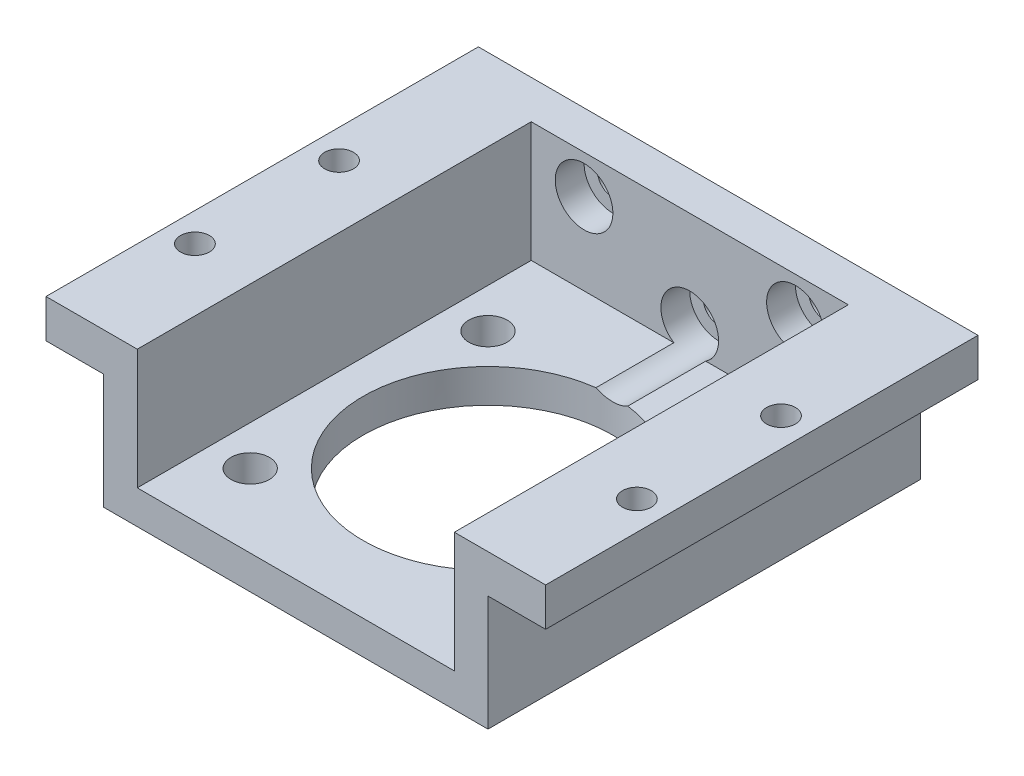
ISO-10303-21;
HEADER;
FILE_DESCRIPTION(('STEP AP214'),'2;1');
FILE_NAME('part.step','',(''),(''),'','','');
FILE_SCHEMA(('AUTOMOTIVE_DESIGN { 1 0 10303 214 1 1 1 1 }'));
ENDSEC;
DATA;
#1=APPLICATION_CONTEXT('core data for automotive mechanical design processes');
#2=APPLICATION_PROTOCOL_DEFINITION('international standard','automotive_design',2000,#1);
#3=PRODUCT_CONTEXT('',#1,'mechanical');
#4=PRODUCT('Part','Part','',(#3));
#5=PRODUCT_RELATED_PRODUCT_CATEGORY('part','',(#4));
#6=PRODUCT_DEFINITION_FORMATION('','',#4);
#7=PRODUCT_DEFINITION_CONTEXT('part definition',#1,'design');
#8=PRODUCT_DEFINITION('design','',#6,#7);
#9=PRODUCT_DEFINITION_SHAPE('','',#8);
#10=(LENGTH_UNIT() NAMED_UNIT(*) SI_UNIT(.MILLI.,.METRE.));
#11=(NAMED_UNIT(*) PLANE_ANGLE_UNIT() SI_UNIT($,.RADIAN.));
#12=(NAMED_UNIT(*) SI_UNIT($,.STERADIAN.) SOLID_ANGLE_UNIT());
#13=UNCERTAINTY_MEASURE_WITH_UNIT(LENGTH_MEASURE(1.E-05),#10,'distance_accuracy_value','');
#14=(GEOMETRIC_REPRESENTATION_CONTEXT(3) GLOBAL_UNCERTAINTY_ASSIGNED_CONTEXT((#13)) GLOBAL_UNIT_ASSIGNED_CONTEXT((#10,
#11,#12)) REPRESENTATION_CONTEXT('',''));
#15=CARTESIAN_POINT('',(0.,0.,0.));
#16=DIRECTION('',(0.,0.,1.));
#17=DIRECTION('',(1.,0.,0.));
#18=AXIS2_PLACEMENT_3D('',#15,#16,#17);
#19=CARTESIAN_POINT('',(0.,14.8987856394065,0.));
#20=DIRECTION('',(0.,1.,0.));
#21=DIRECTION('',(0.,0.,1.));
#22=AXIS2_PLACEMENT_3D('',#19,#20,#21);
#23=PLANE('',#22);
#24=CARTESIAN_POINT('',(12.3743686707646,14.8987856394065,32.3743686707646));
#25=DIRECTION('',(0.,1.,0.));
#26=DIRECTION('',(0.,0.,1.));
#27=AXIS2_PLACEMENT_3D('',#24,#25,#26);
#28=CIRCLE('',#27,2.);
#29=CARTESIAN_POINT('',(12.3743686707646,14.8987856394065,34.3743686707646));
#30=VERTEX_POINT('',#29);
#31=EDGE_CURVE('E233',#30,#30,#28,.F.);
#32=ORIENTED_EDGE('',*,*,#31,.T.);
#33=EDGE_LOOP('',(#32));
#34=FACE_BOUND('',#33,.T.);
#35=CARTESIAN_POINT('',(-12.3743686707646,14.8987856394065,7.62563132923544));
#36=DIRECTION('',(0.,1.,0.));
#37=DIRECTION('',(0.,0.,1.));
#38=AXIS2_PLACEMENT_3D('',#35,#36,#37);
#39=CIRCLE('',#38,2.);
#40=CARTESIAN_POINT('',(-12.3743686707646,14.8987856394065,9.62563132923544));
#41=VERTEX_POINT('',#40);
#42=EDGE_CURVE('E227',#41,#41,#39,.F.);
#43=ORIENTED_EDGE('',*,*,#42,.T.);
#44=EDGE_LOOP('',(#43));
#45=FACE_BOUND('',#44,.T.);
#46=CARTESIAN_POINT('',(-12.3743686707644,14.8987856394065,32.3743686707647));
#47=DIRECTION('',(0.,1.,0.));
#48=DIRECTION('',(0.,0.,1.));
#49=AXIS2_PLACEMENT_3D('',#46,#47,#48);
#50=CIRCLE('',#49,2.);
#51=CARTESIAN_POINT('',(-12.3743686707644,14.8987856394065,34.3743686707647));
#52=VERTEX_POINT('',#51);
#53=EDGE_CURVE('E226',#52,#52,#50,.F.);
#54=ORIENTED_EDGE('',*,*,#53,.T.);
#55=EDGE_LOOP('',(#54));
#56=FACE_BOUND('',#55,.T.);
#57=CARTESIAN_POINT('',(12.3743686707645,14.8987856394065,7.62563132923535));
#58=DIRECTION('',(0.,1.,0.));
#59=DIRECTION('',(0.,0.,1.));
#60=AXIS2_PLACEMENT_3D('',#57,#58,#59);
#61=CIRCLE('',#60,2.);
#62=CARTESIAN_POINT('',(12.3743686707645,14.8987856394065,9.62563132923535));
#63=VERTEX_POINT('',#62);
#64=EDGE_CURVE('E230',#63,#63,#61,.F.);
#65=ORIENTED_EDGE('',*,*,#64,.T.);
#66=EDGE_LOOP('',(#65));
#67=FACE_BOUND('',#66,.T.);
#68=DIRECTION('',(1.,0.,0.));
#69=VECTOR('',#68,1.);
#70=CARTESIAN_POINT('',(-16.5,14.8987856394065,-1.));
#71=LINE('',#70,#69);
#72=CARTESIAN_POINT('',(1.65831239517132,14.8987856394065,-1.));
#73=VERTEX_POINT('',#72);
#74=CARTESIAN_POINT('',(16.5,14.8987856394065,-1.));
#75=VERTEX_POINT('',#74);
#76=EDGE_CURVE('E164',#73,#75,#71,.T.);
#77=ORIENTED_EDGE('',*,*,#76,.F.);
#78=DIRECTION('',(0.,0.,-1.));
#79=VECTOR('',#78,1.);
#80=CARTESIAN_POINT('',(1.65831239517132,14.8987856394065,13.));
#81=LINE('',#80,#79);
#82=CARTESIAN_POINT('',(1.65831239517132,14.8987856394065,7.10620304177155));
#83=VERTEX_POINT('',#82);
#84=EDGE_CURVE('E151',#73,#83,#81,.F.);
#85=ORIENTED_EDGE('',*,*,#84,.T.);
#86=CARTESIAN_POINT('',(0.,14.8987856394065,20.));
#87=DIRECTION('',(0.,1.,0.));
#88=DIRECTION('',(0.,0.,1.));
#89=AXIS2_PLACEMENT_3D('',#86,#87,#88);
#90=CIRCLE('',#89,13.);
#91=CARTESIAN_POINT('',(-1.65831239517136,14.8987856394065,7.10620304177156));
#92=VERTEX_POINT('',#91);
#93=EDGE_CURVE('E148',#83,#92,#90,.F.);
#94=ORIENTED_EDGE('',*,*,#93,.T.);
#95=DIRECTION('',(0.,0.,-1.));
#96=VECTOR('',#95,1.);
#97=CARTESIAN_POINT('',(-1.65831239517136,14.8987856394065,13.));
#98=LINE('',#97,#96);
#99=CARTESIAN_POINT('',(-1.65831239517136,14.8987856394065,-1.));
#100=VERTEX_POINT('',#99);
#101=EDGE_CURVE('E141',#92,#100,#98,.T.);
#102=ORIENTED_EDGE('',*,*,#101,.T.);
#103=CARTESIAN_POINT('',(-16.5,14.8987856394065,-1.));
#104=VERTEX_POINT('',#103);
#105=EDGE_CURVE('E145',#104,#100,#71,.T.);
#106=ORIENTED_EDGE('',*,*,#105,.F.);
#107=DIRECTION('',(0.,0.,1.));
#108=VECTOR('',#107,1.);
#109=CARTESIAN_POINT('',(-16.5,14.8987856394065,0.));
#110=LINE('',#109,#108);
#111=CARTESIAN_POINT('',(-16.5,14.8987856394065,40.));
#112=VERTEX_POINT('',#111);
#113=EDGE_CURVE('E221',#104,#112,#110,.T.);
#114=ORIENTED_EDGE('',*,*,#113,.T.);
#115=DIRECTION('',(1.,0.,0.));
#116=VECTOR('',#115,1.);
#117=CARTESIAN_POINT('',(-16.5,14.8987856394065,40.));
#118=LINE('',#117,#116);
#119=CARTESIAN_POINT('',(16.5,14.8987856394065,40.));
#120=VERTEX_POINT('',#119);
#121=EDGE_CURVE('E223',#112,#120,#118,.T.);
#122=ORIENTED_EDGE('',*,*,#121,.T.);
#123=DIRECTION('',(0.,0.,-1.));
#124=VECTOR('',#123,1.);
#125=CARTESIAN_POINT('',(16.5,14.8987856394065,40.));
#126=LINE('',#125,#124);
#127=EDGE_CURVE('E218',#120,#75,#126,.T.);
#128=ORIENTED_EDGE('',*,*,#127,.T.);
#129=EDGE_LOOP('',(#77,#85,#94,#102,#106,#114,#122,#128));
#130=FACE_BOUND('',#129,.T.);
#131=ADVANCED_FACE('F36',(#34,#45,#56,#67,#130),#23,.T.);
#132=CARTESIAN_POINT('',(0.,12.8987856394065,20.));
#133=DIRECTION('',(0.,-1.,0.));
#134=DIRECTION('',(0.,0.,-1.));
#135=AXIS2_PLACEMENT_3D('',#132,#133,#134);
#136=CYLINDRICAL_SURFACE('',#135,13.);
#137=CARTESIAN_POINT('',(0.,11.3987856394065,20.));
#138=DIRECTION('',(0.,-1.,0.));
#139=DIRECTION('',(0.,0.,-1.));
#140=AXIS2_PLACEMENT_3D('',#137,#138,#139);
#141=CIRCLE('',#140,13.);
#142=CARTESIAN_POINT('',(0.,11.3987856394065,7.));
#143=VERTEX_POINT('',#142);
#144=EDGE_CURVE('E261',#143,#143,#141,.T.);
#145=ORIENTED_EDGE('',*,*,#144,.T.);
#146=EDGE_LOOP('',(#145));
#147=FACE_BOUND('',#146,.T.);
#148=CARTESIAN_POINT('',(-1.65831239517136,14.8987856394065,7.10620304177156));
#149=CARTESIAN_POINT('',(-1.58917337928414,14.8529156980806,7.09730652770441));
#150=CARTESIAN_POINT('',(-1.51809501336854,14.8099066072626,7.08873442003573));
#151=CARTESIAN_POINT('',(-1.37253781385034,14.7298854962119,7.07245287781366));
#152=CARTESIAN_POINT('',(-1.29805871328552,14.6928739478352,7.06474351115108));
#153=CARTESIAN_POINT('',(-1.14619232088081,14.6251319392714,7.05040306291785));
#154=CARTESIAN_POINT('',(-1.06880514474718,14.5944012294952,7.043771938502));
#155=CARTESIAN_POINT('',(-0.911684032361171,14.5394554892221,7.03176736088165));
#156=CARTESIAN_POINT('',(-0.831950212924656,14.5152401349973,7.02639384519223));
#157=CARTESIAN_POINT('',(-0.58985948830316,14.4526357920474,7.01238771543384));
#158=CARTESIAN_POINT('',(-0.42464086047965,14.4243008004801,7.00587220229429));
#159=CARTESIAN_POINT('',(-0.0918149055802086,14.3955390174663,6.99925766115733));
#160=CARTESIAN_POINT('',(0.0757913245900093,14.3950997990986,6.99915577603731));
#161=CARTESIAN_POINT('',(0.406403309525051,14.4218784309378,7.00531589648959));
#162=CARTESIAN_POINT('',(0.569440603354921,14.4487284009382,7.01149325298217));
#163=CARTESIAN_POINT('',(0.888614567429246,14.5286989673259,7.02942211090079));
#164=CARTESIAN_POINT('',(1.04475368473339,14.5818101649522,7.04117161802074));
#165=CARTESIAN_POINT('',(1.27609866620275,14.6822853139574,7.06252661744434));
#166=CARTESIAN_POINT('',(1.35534085855768,14.7209491676354,7.07061095010091));
#167=CARTESIAN_POINT('',(1.509864873022,14.8049434236501,7.08774443963407));
#168=CARTESIAN_POINT('',(1.58515530897964,14.8502584326108,7.09679135576105));
#169=CARTESIAN_POINT('',(1.65831239517132,14.8987856394065,7.10620304177155));
#170=B_SPLINE_CURVE_WITH_KNOTS('',3,(#148,#149,#150,#151,#152,#153,#154,#155,#156,#157,#158,
#159,#160,#161,#162,#163,#164,#165,#166,#167,#168,#169),.UNSPECIFIED.,.F.,.F.,(4,2,2,2,2,2,2,2,
2,2,4),(0.,0.250267884749929,0.500555449754726,0.750833066860513,1.00109824615303,
1.50171827486213,2.0021152873741,2.49585486768469,2.98941786885134,3.25473777078574,
3.5194530281394),.UNSPECIFIED.);
#171=EDGE_CURVE('E152',#92,#83,#170,.T.);
#172=ORIENTED_EDGE('',*,*,#171,.F.);
#173=ORIENTED_EDGE('',*,*,#93,.F.);
#174=EDGE_LOOP('',(#172,#173));
#175=FACE_BOUND('',#174,.T.);
#176=ADVANCED_FACE('F317',(#147,#175),#136,.F.);
#177=CARTESIAN_POINT('',(10.9999999999999,23.3987856394065,-1.));
#178=DIRECTION('',(0.,0.,-1.));
#179=DIRECTION('',(-1.,0.,0.));
#180=AXIS2_PLACEMENT_3D('',#177,#178,#179);
#181=CYLINDRICAL_SURFACE('',#180,1.6);
#182=CARTESIAN_POINT('',(10.9999999999999,23.3987856394065,-5.));
#183=DIRECTION('',(0.,0.,-1.));
#184=DIRECTION('',(-1.,0.,0.));
#185=AXIS2_PLACEMENT_3D('',#182,#183,#184);
#186=CIRCLE('',#185,1.6);
#187=CARTESIAN_POINT('',(9.3999999999999,23.3987856394065,-5.));
#188=VERTEX_POINT('',#187);
#189=EDGE_CURVE('E167',#188,#188,#186,.T.);
#190=ORIENTED_EDGE('',*,*,#189,.T.);
#191=EDGE_LOOP('',(#190));
#192=FACE_BOUND('',#191,.T.);
#193=CARTESIAN_POINT('',(10.9999999999999,23.3987856394065,-4.));
#194=DIRECTION('',(0.,0.,1.));
#195=DIRECTION('',(1.,0.,0.));
#196=AXIS2_PLACEMENT_3D('',#193,#194,#195);
#197=CIRCLE('',#196,1.6);
#198=CARTESIAN_POINT('',(12.5999999999999,23.3987856394065,-4.));
#199=VERTEX_POINT('',#198);
#200=EDGE_CURVE('E396',#199,#199,#197,.T.);
#201=ORIENTED_EDGE('',*,*,#200,.T.);
#202=EDGE_LOOP('',(#201));
#203=FACE_BOUND('',#202,.T.);
#204=ADVANCED_FACE('F323',(#192,#203),#181,.F.);
#205=CARTESIAN_POINT('',(0.,17.3987856394107,-1.));
#206=DIRECTION('',(0.,0.,-1.));
#207=DIRECTION('',(-1.,0.,0.));
#208=AXIS2_PLACEMENT_3D('',#205,#206,#207);
#209=CYLINDRICAL_SURFACE('',#208,1.6);
#210=CARTESIAN_POINT('',(0.,17.3987856394107,-5.));
#211=DIRECTION('',(0.,0.,-1.));
#212=DIRECTION('',(-1.,0.,0.));
#213=AXIS2_PLACEMENT_3D('',#210,#211,#212);
#214=CIRCLE('',#213,1.6);
#215=CARTESIAN_POINT('',(-1.60000000000002,17.3987856394107,-5.));
#216=VERTEX_POINT('',#215);
#217=EDGE_CURVE('E764',#216,#216,#214,.T.);
#218=ORIENTED_EDGE('',*,*,#217,.T.);
#219=EDGE_LOOP('',(#218));
#220=FACE_BOUND('',#219,.T.);
#221=CARTESIAN_POINT('',(0.,17.3987856394107,-4.));
#222=DIRECTION('',(0.,0.,1.));
#223=DIRECTION('',(1.,0.,0.));
#224=AXIS2_PLACEMENT_3D('',#221,#222,#223);
#225=CIRCLE('',#224,1.6);
#226=CARTESIAN_POINT('',(1.59999999999998,17.3987856394107,-4.));
#227=VERTEX_POINT('',#226);
#228=EDGE_CURVE('E159',#227,#227,#225,.T.);
#229=ORIENTED_EDGE('',*,*,#228,.T.);
#230=EDGE_LOOP('',(#229));
#231=FACE_BOUND('',#230,.T.);
#232=ADVANCED_FACE('F430',(#220,#231),#209,.F.);
#233=CARTESIAN_POINT('',(-10.9999999999999,23.3987856394065,-1.));
#234=DIRECTION('',(0.,0.,-1.));
#235=DIRECTION('',(-1.,0.,0.));
#236=AXIS2_PLACEMENT_3D('',#233,#234,#235);
#237=CYLINDRICAL_SURFACE('',#236,1.6);
#238=CARTESIAN_POINT('',(-10.9999999999999,23.3987856394065,-5.));
#239=DIRECTION('',(0.,0.,-1.));
#240=DIRECTION('',(-1.,0.,0.));
#241=AXIS2_PLACEMENT_3D('',#238,#239,#240);
#242=CIRCLE('',#241,1.6);
#243=CARTESIAN_POINT('',(-12.5999999999999,23.3987856394065,-5.));
#244=VERTEX_POINT('',#243);
#245=EDGE_CURVE('E759',#244,#244,#242,.F.);
#246=ORIENTED_EDGE('',*,*,#245,.F.);
#247=EDGE_LOOP('',(#246));
#248=FACE_BOUND('',#247,.T.);
#249=CARTESIAN_POINT('',(-10.9999999999999,23.3987856394065,-4.));
#250=DIRECTION('',(0.,0.,1.));
#251=DIRECTION('',(1.,0.,0.));
#252=AXIS2_PLACEMENT_3D('',#249,#250,#251);
#253=CIRCLE('',#252,1.6);
#254=CARTESIAN_POINT('',(-9.39999999999989,23.3987856394065,-4.));
#255=VERTEX_POINT('',#254);
#256=EDGE_CURVE('E756',#255,#255,#253,.T.);
#257=ORIENTED_EDGE('',*,*,#256,.T.);
#258=EDGE_LOOP('',(#257));
#259=FACE_BOUND('',#258,.T.);
#260=ADVANCED_FACE('F433',(#248,#259),#237,.F.);
#261=CARTESIAN_POINT('',(0.,0.,-5.));
#262=DIRECTION('',(0.,0.,1.));
#263=DIRECTION('',(1.,0.,0.));
#264=AXIS2_PLACEMENT_3D('',#261,#262,#263);
#265=PLANE('',#264);
#266=DIRECTION('',(1.,0.,0.));
#267=VECTOR('',#266,1.);
#268=CARTESIAN_POINT('',(-20.,11.3987856394065,-5.));
#269=LINE('',#268,#267);
#270=CARTESIAN_POINT('',(-20.,11.3987856394065,-5.));
#271=VERTEX_POINT('',#270);
#272=CARTESIAN_POINT('',(20.,11.3987856394065,-5.));
#273=VERTEX_POINT('',#272);
#274=EDGE_CURVE('E173',#271,#273,#269,.T.);
#275=ORIENTED_EDGE('',*,*,#274,.F.);
#276=DIRECTION('',(0.,-1.,0.));
#277=VECTOR('',#276,1.);
#278=CARTESIAN_POINT('',(-20.,23.3987856394065,-5.));
#279=LINE('',#278,#277);
#280=CARTESIAN_POINT('',(-20.,23.3987856394065,-5.));
#281=VERTEX_POINT('',#280);
#282=EDGE_CURVE('E194',#281,#271,#279,.T.);
#283=ORIENTED_EDGE('',*,*,#282,.F.);
#284=DIRECTION('',(1.,0.,0.));
#285=VECTOR('',#284,1.);
#286=CARTESIAN_POINT('',(-26.,23.3987856394065,-5.));
#287=LINE('',#286,#285);
#288=CARTESIAN_POINT('',(-26.,23.3987856394065,-5.));
#289=VERTEX_POINT('',#288);
#290=EDGE_CURVE('E191',#289,#281,#287,.T.);
#291=ORIENTED_EDGE('',*,*,#290,.F.);
#292=DIRECTION('',(0.,-1.,0.));
#293=VECTOR('',#292,1.);
#294=CARTESIAN_POINT('',(-26.,27.3987856394065,-5.));
#295=LINE('',#294,#293);
#296=CARTESIAN_POINT('',(-26.,27.3987856394065,-5.));
#297=VERTEX_POINT('',#296);
#298=EDGE_CURVE('E188',#297,#289,#295,.T.);
#299=ORIENTED_EDGE('',*,*,#298,.F.);
#300=DIRECTION('',(-1.,0.,0.));
#301=VECTOR('',#300,1.);
#302=CARTESIAN_POINT('',(-16.5,27.3987856394065,-5.));
#303=LINE('',#302,#301);
#304=CARTESIAN_POINT('',(26.,27.3987856394065,-5.));
#305=VERTEX_POINT('',#304);
#306=EDGE_CURVE('E185',#305,#297,#303,.T.);
#307=ORIENTED_EDGE('',*,*,#306,.F.);
#308=DIRECTION('',(0.,1.,0.));
#309=VECTOR('',#308,1.);
#310=CARTESIAN_POINT('',(26.,23.3987856394065,-5.));
#311=LINE('',#310,#309);
#312=CARTESIAN_POINT('',(26.,23.3987856394065,-5.));
#313=VERTEX_POINT('',#312);
#314=EDGE_CURVE('E182',#313,#305,#311,.T.);
#315=ORIENTED_EDGE('',*,*,#314,.F.);
#316=DIRECTION('',(1.,0.,0.));
#317=VECTOR('',#316,1.);
#318=CARTESIAN_POINT('',(20.,23.3987856394065,-5.));
#319=LINE('',#318,#317);
#320=CARTESIAN_POINT('',(20.,23.3987856394065,-5.));
#321=VERTEX_POINT('',#320);
#322=EDGE_CURVE('E179',#321,#313,#319,.T.);
#323=ORIENTED_EDGE('',*,*,#322,.F.);
#324=DIRECTION('',(0.,1.,0.));
#325=VECTOR('',#324,1.);
#326=CARTESIAN_POINT('',(20.,11.3987856394065,-5.));
#327=LINE('',#326,#325);
#328=EDGE_CURVE('E176',#273,#321,#327,.T.);
#329=ORIENTED_EDGE('',*,*,#328,.F.);
#330=EDGE_LOOP('',(#275,#283,#291,#299,#307,#315,#323,#329));
#331=FACE_BOUND('',#330,.T.);
#332=ORIENTED_EDGE('',*,*,#189,.F.);
#333=EDGE_LOOP('',(#332));
#334=FACE_BOUND('',#333,.T.);
#335=ORIENTED_EDGE('',*,*,#245,.T.);
#336=EDGE_LOOP('',(#335));
#337=FACE_BOUND('',#336,.T.);
#338=ORIENTED_EDGE('',*,*,#217,.F.);
#339=EDGE_LOOP('',(#338));
#340=FACE_BOUND('',#339,.T.);
#341=ADVANCED_FACE('F363',(#331,#334,#337,#340),#265,.F.);
#342=CARTESIAN_POINT('',(-16.5,60.6403259165958,-1.));
#343=DIRECTION('',(0.,0.,-1.));
#344=DIRECTION('',(-1.,0.,0.));
#345=AXIS2_PLACEMENT_3D('',#342,#343,#344);
#346=PLANE('',#345);
#347=CARTESIAN_POINT('',(10.9999999999999,23.3987856394065,-1.));
#348=DIRECTION('',(0.,0.,1.));
#349=DIRECTION('',(1.,0.,0.));
#350=AXIS2_PLACEMENT_3D('',#347,#348,#349);
#351=CIRCLE('',#350,3.);
#352=CARTESIAN_POINT('',(13.9999999999999,23.3987856394065,-1.));
#353=VERTEX_POINT('',#352);
#354=EDGE_CURVE('E750',#353,#353,#351,.T.);
#355=ORIENTED_EDGE('',*,*,#354,.F.);
#356=EDGE_LOOP('',(#355));
#357=FACE_BOUND('',#356,.T.);
#358=CARTESIAN_POINT('',(-10.9999999999999,23.3987856394065,-1.));
#359=DIRECTION('',(0.,0.,1.));
#360=DIRECTION('',(1.,0.,0.));
#361=AXIS2_PLACEMENT_3D('',#358,#359,#360);
#362=CIRCLE('',#361,3.);
#363=CARTESIAN_POINT('',(-7.9999999999999,23.3987856394065,-1.));
#364=VERTEX_POINT('',#363);
#365=EDGE_CURVE('E753',#364,#364,#362,.T.);
#366=ORIENTED_EDGE('',*,*,#365,.F.);
#367=EDGE_LOOP('',(#366));
#368=FACE_BOUND('',#367,.T.);
#369=ORIENTED_EDGE('',*,*,#105,.T.);
#370=CARTESIAN_POINT('',(0.,17.3987856394107,-1.));
#371=DIRECTION('',(0.,0.,1.));
#372=DIRECTION('',(1.,0.,0.));
#373=AXIS2_PLACEMENT_3D('',#370,#371,#372);
#374=CIRCLE('',#373,3.);
#375=EDGE_CURVE('E155',#73,#100,#374,.T.);
#376=ORIENTED_EDGE('',*,*,#375,.F.);
#377=ORIENTED_EDGE('',*,*,#76,.T.);
#378=DIRECTION('',(0.,-1.,0.));
#379=VECTOR('',#378,1.);
#380=CARTESIAN_POINT('',(16.5,60.6403259165958,-1.));
#381=LINE('',#380,#379);
#382=CARTESIAN_POINT('',(16.5,27.3987856394065,-1.));
#383=VERTEX_POINT('',#382);
#384=EDGE_CURVE('E163',#383,#75,#381,.T.);
#385=ORIENTED_EDGE('',*,*,#384,.F.);
#386=DIRECTION('',(-1.,0.,0.));
#387=VECTOR('',#386,1.);
#388=CARTESIAN_POINT('',(-16.5,27.3987856394065,-1.));
#389=LINE('',#388,#387);
#390=CARTESIAN_POINT('',(-16.5,27.3987856394065,-1.));
#391=VERTEX_POINT('',#390);
#392=EDGE_CURVE('E169',#383,#391,#389,.T.);
#393=ORIENTED_EDGE('',*,*,#392,.T.);
#394=DIRECTION('',(0.,-1.,0.));
#395=VECTOR('',#394,1.);
#396=CARTESIAN_POINT('',(-16.5,60.6403259165958,-1.));
#397=LINE('',#396,#395);
#398=EDGE_CURVE('E61',#391,#104,#397,.T.);
#399=ORIENTED_EDGE('',*,*,#398,.T.);
#400=EDGE_LOOP('',(#369,#376,#377,#385,#393,#399));
#401=FACE_BOUND('',#400,.T.);
#402=ADVANCED_FACE('F161',(#357,#368,#401),#346,.F.);
#403=CARTESIAN_POINT('',(16.5,16.3987856394065,40.));
#404=DIRECTION('',(1.,0.,0.));
#405=DIRECTION('',(0.,1.,0.));
#406=AXIS2_PLACEMENT_3D('',#403,#404,#405);
#407=PLANE('',#406);
#408=ORIENTED_EDGE('',*,*,#384,.T.);
#409=ORIENTED_EDGE('',*,*,#127,.F.);
#410=DIRECTION('',(0.,-1.,0.));
#411=VECTOR('',#410,1.);
#412=CARTESIAN_POINT('',(16.5,16.3987856394065,40.));
#413=LINE('',#412,#411);
#414=CARTESIAN_POINT('',(16.5,27.3987856394065,40.));
#415=VERTEX_POINT('',#414);
#416=EDGE_CURVE('E277',#415,#120,#413,.T.);
#417=ORIENTED_EDGE('',*,*,#416,.F.);
#418=DIRECTION('',(0.,0.,-1.));
#419=VECTOR('',#418,1.);
#420=CARTESIAN_POINT('',(16.5,27.3987856394065,40.));
#421=LINE('',#420,#419);
#422=EDGE_CURVE('E53',#415,#383,#421,.T.);
#423=ORIENTED_EDGE('',*,*,#422,.T.);
#424=EDGE_LOOP('',(#408,#409,#417,#423));
#425=FACE_BOUND('',#424,.T.);
#426=ADVANCED_FACE('F395',(#425),#407,.F.);
#427=CARTESIAN_POINT('',(-16.5,27.3987856394065,40.));
#428=DIRECTION('',(-1.,0.,0.));
#429=DIRECTION('',(0.,-1.,0.));
#430=AXIS2_PLACEMENT_3D('',#427,#428,#429);
#431=PLANE('',#430);
#432=ORIENTED_EDGE('',*,*,#398,.F.);
#433=DIRECTION('',(0.,0.,-1.));
#434=VECTOR('',#433,1.);
#435=CARTESIAN_POINT('',(-16.5,27.3987856394065,40.));
#436=LINE('',#435,#434);
#437=CARTESIAN_POINT('',(-16.5,27.3987856394065,40.));
#438=VERTEX_POINT('',#437);
#439=EDGE_CURVE('E285',#438,#391,#436,.T.);
#440=ORIENTED_EDGE('',*,*,#439,.F.);
#441=DIRECTION('',(0.,1.,0.));
#442=VECTOR('',#441,1.);
#443=CARTESIAN_POINT('',(-16.5,27.3987856394065,40.));
#444=LINE('',#443,#442);
#445=EDGE_CURVE('E279',#112,#438,#444,.T.);
#446=ORIENTED_EDGE('',*,*,#445,.F.);
#447=ORIENTED_EDGE('',*,*,#113,.F.);
#448=EDGE_LOOP('',(#432,#440,#446,#447));
#449=FACE_BOUND('',#448,.T.);
#450=ADVANCED_FACE('F340',(#449),#431,.F.);
#451=CARTESIAN_POINT('',(26.,27.3987856394065,40.));
#452=DIRECTION('',(-1.,0.,0.));
#453=DIRECTION('',(0.,-1.,0.));
#454=AXIS2_PLACEMENT_3D('',#451,#452,#453);
#455=PLANE('',#454);
#456=DIRECTION('',(0.,0.,1.));
#457=VECTOR('',#456,1.);
#458=CARTESIAN_POINT('',(26.,23.3987856394065,0.));
#459=LINE('',#458,#457);
#460=CARTESIAN_POINT('',(26.,23.3987856394065,40.));
#461=VERTEX_POINT('',#460);
#462=EDGE_CURVE('E199',#313,#461,#459,.T.);
#463=ORIENTED_EDGE('',*,*,#462,.F.);
#464=ORIENTED_EDGE('',*,*,#314,.T.);
#465=DIRECTION('',(0.,0.,-1.));
#466=VECTOR('',#465,1.);
#467=CARTESIAN_POINT('',(26.,27.3987856394065,40.));
#468=LINE('',#467,#466);
#469=CARTESIAN_POINT('',(26.,27.3987856394065,40.));
#470=VERTEX_POINT('',#469);
#471=EDGE_CURVE('E288',#470,#305,#468,.T.);
#472=ORIENTED_EDGE('',*,*,#471,.F.);
#473=DIRECTION('',(0.,1.,0.));
#474=VECTOR('',#473,1.);
#475=CARTESIAN_POINT('',(26.,27.3987856394065,40.));
#476=LINE('',#475,#474);
#477=EDGE_CURVE('E273',#461,#470,#476,.T.);
#478=ORIENTED_EDGE('',*,*,#477,.F.);
#479=EDGE_LOOP('',(#463,#464,#472,#478));
#480=FACE_BOUND('',#479,.T.);
#481=ADVANCED_FACE('F335',(#480),#455,.F.);
#482=CARTESIAN_POINT('',(23.,27.3987856394065,27.5));
#483=DIRECTION('',(0.,-1.,0.));
#484=DIRECTION('',(1.,0.,0.));
#485=AXIS2_PLACEMENT_3D('',#482,#483,#484);
#486=CYLINDRICAL_SURFACE('',#485,1.5);
#487=CARTESIAN_POINT('',(23.,27.3987856394065,27.5));
#488=DIRECTION('',(0.,1.,0.));
#489=DIRECTION('',(0.,0.,-1.));
#490=AXIS2_PLACEMENT_3D('',#487,#488,#489);
#491=CIRCLE('',#490,1.5);
#492=CARTESIAN_POINT('',(23.,27.3987856394065,26.));
#493=VERTEX_POINT('',#492);
#494=EDGE_CURVE('E240',#493,#493,#491,.T.);
#495=ORIENTED_EDGE('',*,*,#494,.T.);
#496=EDGE_LOOP('',(#495));
#497=FACE_BOUND('',#496,.T.);
#498=CARTESIAN_POINT('',(23.,23.3987856394065,27.5));
#499=DIRECTION('',(0.,-1.,0.));
#500=DIRECTION('',(0.,0.,-1.));
#501=AXIS2_PLACEMENT_3D('',#498,#499,#500);
#502=CIRCLE('',#501,1.5);
#503=CARTESIAN_POINT('',(23.,23.3987856394065,26.));
#504=VERTEX_POINT('',#503);
#505=EDGE_CURVE('E204',#504,#504,#502,.T.);
#506=ORIENTED_EDGE('',*,*,#505,.T.);
#507=EDGE_LOOP('',(#506));
#508=FACE_BOUND('',#507,.T.);
#509=ADVANCED_FACE('F332',(#497,#508),#486,.F.);
#510=CARTESIAN_POINT('',(23.,27.3987856394065,12.5));
#511=DIRECTION('',(0.,-1.,0.));
#512=DIRECTION('',(1.,0.,0.));
#513=AXIS2_PLACEMENT_3D('',#510,#511,#512);
#514=CYLINDRICAL_SURFACE('',#513,1.5);
#515=CARTESIAN_POINT('',(23.,27.3987856394065,12.5));
#516=DIRECTION('',(0.,1.,0.));
#517=DIRECTION('',(0.,0.,-1.));
#518=AXIS2_PLACEMENT_3D('',#515,#516,#517);
#519=CIRCLE('',#518,1.5);
#520=CARTESIAN_POINT('',(23.,27.3987856394065,11.));
#521=VERTEX_POINT('',#520);
#522=EDGE_CURVE('E237',#521,#521,#519,.T.);
#523=ORIENTED_EDGE('',*,*,#522,.T.);
#524=EDGE_LOOP('',(#523));
#525=FACE_BOUND('',#524,.T.);
#526=CARTESIAN_POINT('',(23.,23.3987856394065,12.5));
#527=DIRECTION('',(0.,-1.,0.));
#528=DIRECTION('',(0.,0.,-1.));
#529=AXIS2_PLACEMENT_3D('',#526,#527,#528);
#530=CIRCLE('',#529,1.5);
#531=CARTESIAN_POINT('',(23.,23.3987856394065,11.));
#532=VERTEX_POINT('',#531);
#533=EDGE_CURVE('E40',#532,#532,#530,.T.);
#534=ORIENTED_EDGE('',*,*,#533,.T.);
#535=EDGE_LOOP('',(#534));
#536=FACE_BOUND('',#535,.T.);
#537=ADVANCED_FACE('F330',(#525,#536),#514,.F.);
#538=CARTESIAN_POINT('',(-26.,27.3987856394065,40.));
#539=DIRECTION('',(1.,0.,0.));
#540=DIRECTION('',(0.,0.,-1.));
#541=AXIS2_PLACEMENT_3D('',#538,#539,#540);
#542=PLANE('',#541);
#543=DIRECTION('',(0.,0.,-1.));
#544=VECTOR('',#543,1.);
#545=CARTESIAN_POINT('',(-26.,23.3987856394065,40.));
#546=LINE('',#545,#544);
#547=CARTESIAN_POINT('',(-26.,23.3987856394065,40.));
#548=VERTEX_POINT('',#547);
#549=EDGE_CURVE('E207',#548,#289,#546,.T.);
#550=ORIENTED_EDGE('',*,*,#549,.F.);
#551=DIRECTION('',(0.,-1.,0.));
#552=VECTOR('',#551,1.);
#553=CARTESIAN_POINT('',(-26.,27.3987856394065,40.));
#554=LINE('',#553,#552);
#555=CARTESIAN_POINT('',(-26.,27.3987856394065,40.));
#556=VERTEX_POINT('',#555);
#557=EDGE_CURVE('E264',#556,#548,#554,.T.);
#558=ORIENTED_EDGE('',*,*,#557,.F.);
#559=DIRECTION('',(0.,0.,-1.));
#560=VECTOR('',#559,1.);
#561=CARTESIAN_POINT('',(-26.,27.3987856394065,40.));
#562=LINE('',#561,#560);
#563=EDGE_CURVE('E283',#556,#297,#562,.T.);
#564=ORIENTED_EDGE('',*,*,#563,.T.);
#565=ORIENTED_EDGE('',*,*,#298,.T.);
#566=EDGE_LOOP('',(#550,#558,#564,#565));
#567=FACE_BOUND('',#566,.T.);
#568=ADVANCED_FACE('F38',(#567),#542,.F.);
#569=CARTESIAN_POINT('',(-23.,27.3987856394065,27.5));
#570=DIRECTION('',(0.,-1.,0.));
#571=DIRECTION('',(0.,0.,-1.));
#572=AXIS2_PLACEMENT_3D('',#569,#570,#571);
#573=CYLINDRICAL_SURFACE('',#572,1.5);
#574=CARTESIAN_POINT('',(-23.,27.3987856394065,27.5));
#575=DIRECTION('',(0.,-1.,0.));
#576=DIRECTION('',(0.,0.,-1.));
#577=AXIS2_PLACEMENT_3D('',#574,#575,#576);
#578=CIRCLE('',#577,1.5);
#579=CARTESIAN_POINT('',(-23.,27.3987856394065,26.));
#580=VERTEX_POINT('',#579);
#581=EDGE_CURVE('E246',#580,#580,#578,.T.);
#582=ORIENTED_EDGE('',*,*,#581,.F.);
#583=EDGE_LOOP('',(#582));
#584=FACE_BOUND('',#583,.T.);
#585=CARTESIAN_POINT('',(-23.,23.3987856394065,27.5));
#586=DIRECTION('',(0.,-1.,0.));
#587=DIRECTION('',(0.,0.,-1.));
#588=AXIS2_PLACEMENT_3D('',#585,#586,#587);
#589=CIRCLE('',#588,1.5);
#590=CARTESIAN_POINT('',(-23.,23.3987856394065,26.));
#591=VERTEX_POINT('',#590);
#592=EDGE_CURVE('E215',#591,#591,#589,.F.);
#593=ORIENTED_EDGE('',*,*,#592,.F.);
#594=EDGE_LOOP('',(#593));
#595=FACE_BOUND('',#594,.T.);
#596=ADVANCED_FACE('F302',(#584,#595),#573,.F.);
#597=CARTESIAN_POINT('',(-23.,27.3987856394065,12.5));
#598=DIRECTION('',(0.,-1.,0.));
#599=DIRECTION('',(0.,0.,-1.));
#600=AXIS2_PLACEMENT_3D('',#597,#598,#599);
#601=CYLINDRICAL_SURFACE('',#600,1.5);
#602=CARTESIAN_POINT('',(-23.,27.3987856394065,12.5));
#603=DIRECTION('',(0.,-1.,0.));
#604=DIRECTION('',(0.,0.,-1.));
#605=AXIS2_PLACEMENT_3D('',#602,#603,#604);
#606=CIRCLE('',#605,1.5);
#607=CARTESIAN_POINT('',(-23.,27.3987856394065,11.));
#608=VERTEX_POINT('',#607);
#609=EDGE_CURVE('E243',#608,#608,#606,.T.);
#610=ORIENTED_EDGE('',*,*,#609,.F.);
#611=EDGE_LOOP('',(#610));
#612=FACE_BOUND('',#611,.T.);
#613=CARTESIAN_POINT('',(-23.,23.3987856394065,12.5));
#614=DIRECTION('',(0.,-1.,0.));
#615=DIRECTION('',(0.,0.,-1.));
#616=AXIS2_PLACEMENT_3D('',#613,#614,#615);
#617=CIRCLE('',#616,1.5);
#618=CARTESIAN_POINT('',(-23.,23.3987856394065,11.));
#619=VERTEX_POINT('',#618);
#620=EDGE_CURVE('E214',#619,#619,#617,.F.);
#621=ORIENTED_EDGE('',*,*,#620,.F.);
#622=EDGE_LOOP('',(#621));
#623=FACE_BOUND('',#622,.T.);
#624=ADVANCED_FACE('F299',(#612,#623),#601,.F.);
#625=CARTESIAN_POINT('',(12.3743686707646,27.3997856394065,32.3743686707646));
#626=DIRECTION('',(0.,-1.,0.));
#627=DIRECTION('',(0.,0.,-1.));
#628=AXIS2_PLACEMENT_3D('',#625,#626,#627);
#629=CYLINDRICAL_SURFACE('',#628,2.);
#630=CARTESIAN_POINT('',(12.3743686707646,11.3987856394065,32.3743686707646));
#631=DIRECTION('',(0.,-1.,0.));
#632=DIRECTION('',(0.,0.,-1.));
#633=AXIS2_PLACEMENT_3D('',#630,#631,#632);
#634=CIRCLE('',#633,2.);
#635=CARTESIAN_POINT('',(12.3743686707646,11.3987856394065,30.3743686707646));
#636=VERTEX_POINT('',#635);
#637=EDGE_CURVE('E258',#636,#636,#634,.T.);
#638=ORIENTED_EDGE('',*,*,#637,.T.);
#639=EDGE_LOOP('',(#638));
#640=FACE_BOUND('',#639,.T.);
#641=ORIENTED_EDGE('',*,*,#31,.F.);
#642=EDGE_LOOP('',(#641));
#643=FACE_BOUND('',#642,.T.);
#644=ADVANCED_FACE('F301',(#640,#643),#629,.F.);
#645=CARTESIAN_POINT('',(12.3743686707645,27.3997856394065,7.62563132923535));
#646=DIRECTION('',(0.,-1.,0.));
#647=DIRECTION('',(0.,0.,-1.));
#648=AXIS2_PLACEMENT_3D('',#645,#646,#647);
#649=CYLINDRICAL_SURFACE('',#648,2.);
#650=CARTESIAN_POINT('',(12.3743686707645,11.3987856394065,7.62563132923535));
#651=DIRECTION('',(0.,-1.,0.));
#652=DIRECTION('',(-1.,0.,0.));
#653=AXIS2_PLACEMENT_3D('',#650,#651,#652);
#654=CIRCLE('',#653,2.);
#655=CARTESIAN_POINT('',(10.3743686707645,11.3987856394065,7.62563132923536));
#656=VERTEX_POINT('',#655);
#657=EDGE_CURVE('E255',#656,#656,#654,.T.);
#658=ORIENTED_EDGE('',*,*,#657,.T.);
#659=EDGE_LOOP('',(#658));
#660=FACE_BOUND('',#659,.T.);
#661=ORIENTED_EDGE('',*,*,#64,.F.);
#662=EDGE_LOOP('',(#661));
#663=FACE_BOUND('',#662,.T.);
#664=ADVANCED_FACE('F309',(#660,#663),#649,.F.);
#665=CARTESIAN_POINT('',(-12.3743686707646,27.3997856394065,7.62563132923544));
#666=DIRECTION('',(0.,-1.,0.));
#667=DIRECTION('',(0.,0.,-1.));
#668=AXIS2_PLACEMENT_3D('',#665,#666,#667);
#669=CYLINDRICAL_SURFACE('',#668,2.);
#670=CARTESIAN_POINT('',(-12.3743686707646,11.3987856394065,7.62563132923544));
#671=DIRECTION('',(0.,-1.,0.));
#672=DIRECTION('',(0.,0.,1.));
#673=AXIS2_PLACEMENT_3D('',#670,#671,#672);
#674=CIRCLE('',#673,2.);
#675=CARTESIAN_POINT('',(-12.3743686707646,11.3987856394065,9.62563132923544));
#676=VERTEX_POINT('',#675);
#677=EDGE_CURVE('E252',#676,#676,#674,.T.);
#678=ORIENTED_EDGE('',*,*,#677,.T.);
#679=EDGE_LOOP('',(#678));
#680=FACE_BOUND('',#679,.T.);
#681=ORIENTED_EDGE('',*,*,#42,.F.);
#682=EDGE_LOOP('',(#681));
#683=FACE_BOUND('',#682,.T.);
#684=ADVANCED_FACE('F638',(#680,#683),#669,.F.);
#685=CARTESIAN_POINT('',(-12.3743686707644,27.3997856394065,32.3743686707647));
#686=DIRECTION('',(0.,-1.,0.));
#687=DIRECTION('',(0.,0.,-1.));
#688=AXIS2_PLACEMENT_3D('',#685,#686,#687);
#689=CYLINDRICAL_SURFACE('',#688,2.);
#690=CARTESIAN_POINT('',(-12.3743686707644,11.3987856394065,32.3743686707647));
#691=DIRECTION('',(0.,-1.,0.));
#692=DIRECTION('',(1.,0.,0.));
#693=AXIS2_PLACEMENT_3D('',#690,#691,#692);
#694=CIRCLE('',#693,2.);
#695=CARTESIAN_POINT('',(-10.3743686707644,11.3987856394065,32.3743686707647));
#696=VERTEX_POINT('',#695);
#697=EDGE_CURVE('E249',#696,#696,#694,.T.);
#698=ORIENTED_EDGE('',*,*,#697,.T.);
#699=EDGE_LOOP('',(#698));
#700=FACE_BOUND('',#699,.T.);
#701=ORIENTED_EDGE('',*,*,#53,.F.);
#702=EDGE_LOOP('',(#701));
#703=FACE_BOUND('',#702,.T.);
#704=ADVANCED_FACE('F497',(#700,#703),#689,.F.);
#705=CARTESIAN_POINT('',(-20.,21.3987856394065,40.));
#706=DIRECTION('',(1.,0.,0.));
#707=DIRECTION('',(0.,0.,-1.));
#708=AXIS2_PLACEMENT_3D('',#705,#706,#707);
#709=PLANE('',#708);
#710=DIRECTION('',(0.,0.,1.));
#711=VECTOR('',#710,1.);
#712=CARTESIAN_POINT('',(-20.,23.3987856394065,0.));
#713=LINE('',#712,#711);
#714=CARTESIAN_POINT('',(-20.,23.3987856394065,40.));
#715=VERTEX_POINT('',#714);
#716=EDGE_CURVE('E209',#281,#715,#713,.T.);
#717=ORIENTED_EDGE('',*,*,#716,.F.);
#718=ORIENTED_EDGE('',*,*,#282,.T.);
#719=DIRECTION('',(0.,0.,-1.));
#720=VECTOR('',#719,1.);
#721=CARTESIAN_POINT('',(-20.,11.3987856394065,40.));
#722=LINE('',#721,#720);
#723=CARTESIAN_POINT('',(-20.,11.3987856394065,40.));
#724=VERTEX_POINT('',#723);
#725=EDGE_CURVE('E11',#724,#271,#722,.T.);
#726=ORIENTED_EDGE('',*,*,#725,.F.);
#727=DIRECTION('',(0.,-1.,0.));
#728=VECTOR('',#727,1.);
#729=CARTESIAN_POINT('',(-20.,21.3987856394065,40.));
#730=LINE('',#729,#728);
#731=EDGE_CURVE('E267',#715,#724,#730,.T.);
#732=ORIENTED_EDGE('',*,*,#731,.F.);
#733=EDGE_LOOP('',(#717,#718,#726,#732));
#734=FACE_BOUND('',#733,.T.);
#735=ADVANCED_FACE('F374',(#734),#709,.F.);
#736=CARTESIAN_POINT('',(-20.,11.3987856394065,40.));
#737=DIRECTION('',(0.,1.,0.));
#738=DIRECTION('',(0.,0.,1.));
#739=AXIS2_PLACEMENT_3D('',#736,#737,#738);
#740=PLANE('',#739);
#741=ORIENTED_EDGE('',*,*,#697,.F.);
#742=EDGE_LOOP('',(#741));
#743=FACE_BOUND('',#742,.T.);
#744=ORIENTED_EDGE('',*,*,#677,.F.);
#745=EDGE_LOOP('',(#744));
#746=FACE_BOUND('',#745,.T.);
#747=ORIENTED_EDGE('',*,*,#657,.F.);
#748=EDGE_LOOP('',(#747));
#749=FACE_BOUND('',#748,.T.);
#750=ORIENTED_EDGE('',*,*,#637,.F.);
#751=EDGE_LOOP('',(#750));
#752=FACE_BOUND('',#751,.T.);
#753=ORIENTED_EDGE('',*,*,#144,.F.);
#754=EDGE_LOOP('',(#753));
#755=FACE_BOUND('',#754,.T.);
#756=ORIENTED_EDGE('',*,*,#725,.T.);
#757=ORIENTED_EDGE('',*,*,#274,.T.);
#758=DIRECTION('',(0.,0.,-1.));
#759=VECTOR('',#758,1.);
#760=CARTESIAN_POINT('',(20.,11.3987856394065,40.));
#761=LINE('',#760,#759);
#762=CARTESIAN_POINT('',(20.,11.3987856394065,40.));
#763=VERTEX_POINT('',#762);
#764=EDGE_CURVE('E45',#763,#273,#761,.T.);
#765=ORIENTED_EDGE('',*,*,#764,.F.);
#766=DIRECTION('',(1.,0.,0.));
#767=VECTOR('',#766,1.);
#768=CARTESIAN_POINT('',(-20.,11.3987856394065,40.));
#769=LINE('',#768,#767);
#770=EDGE_CURVE('E269',#724,#763,#769,.T.);
#771=ORIENTED_EDGE('',*,*,#770,.F.);
#772=EDGE_LOOP('',(#756,#757,#765,#771));
#773=FACE_BOUND('',#772,.T.);
#774=ADVANCED_FACE('F369',(#743,#746,#749,#752,#755,#773),#740,.F.);
#775=CARTESIAN_POINT('',(20.,16.3987856394065,40.));
#776=DIRECTION('',(-1.,0.,0.));
#777=DIRECTION('',(0.,0.,1.));
#778=AXIS2_PLACEMENT_3D('',#775,#776,#777);
#779=PLANE('',#778);
#780=ORIENTED_EDGE('',*,*,#764,.T.);
#781=ORIENTED_EDGE('',*,*,#328,.T.);
#782=DIRECTION('',(0.,0.,-1.));
#783=VECTOR('',#782,1.);
#784=CARTESIAN_POINT('',(20.,23.3987856394065,40.));
#785=LINE('',#784,#783);
#786=CARTESIAN_POINT('',(20.,23.3987856394065,40.));
#787=VERTEX_POINT('',#786);
#788=EDGE_CURVE('E197',#787,#321,#785,.T.);
#789=ORIENTED_EDGE('',*,*,#788,.F.);
#790=DIRECTION('',(0.,1.,0.));
#791=VECTOR('',#790,1.);
#792=CARTESIAN_POINT('',(20.,16.3987856394065,40.));
#793=LINE('',#792,#791);
#794=EDGE_CURVE('E271',#763,#787,#793,.T.);
#795=ORIENTED_EDGE('',*,*,#794,.F.);
#796=EDGE_LOOP('',(#780,#781,#789,#795));
#797=FACE_BOUND('',#796,.T.);
#798=ADVANCED_FACE('F365',(#797),#779,.F.);
#799=CARTESIAN_POINT('',(-26.,27.3987856394065,40.));
#800=DIRECTION('',(0.,-1.,0.));
#801=DIRECTION('',(0.,0.,-1.));
#802=AXIS2_PLACEMENT_3D('',#799,#800,#801);
#803=PLANE('',#802);
#804=ORIENTED_EDGE('',*,*,#609,.T.);
#805=EDGE_LOOP('',(#804));
#806=FACE_BOUND('',#805,.T.);
#807=ORIENTED_EDGE('',*,*,#581,.T.);
#808=EDGE_LOOP('',(#807));
#809=FACE_BOUND('',#808,.T.);
#810=ORIENTED_EDGE('',*,*,#439,.T.);
#811=ORIENTED_EDGE('',*,*,#392,.F.);
#812=ORIENTED_EDGE('',*,*,#422,.F.);
#813=DIRECTION('',(-1.,0.,0.));
#814=VECTOR('',#813,1.);
#815=CARTESIAN_POINT('',(16.5,27.3987856394065,40.));
#816=LINE('',#815,#814);
#817=EDGE_CURVE('E275',#470,#415,#816,.T.);
#818=ORIENTED_EDGE('',*,*,#817,.F.);
#819=ORIENTED_EDGE('',*,*,#471,.T.);
#820=ORIENTED_EDGE('',*,*,#306,.T.);
#821=ORIENTED_EDGE('',*,*,#563,.F.);
#822=DIRECTION('',(-1.,0.,0.));
#823=VECTOR('',#822,1.);
#824=CARTESIAN_POINT('',(-26.,27.3987856394065,40.));
#825=LINE('',#824,#823);
#826=EDGE_CURVE('E281',#438,#556,#825,.T.);
#827=ORIENTED_EDGE('',*,*,#826,.F.);
#828=EDGE_LOOP('',(#810,#811,#812,#818,#819,#820,#821,#827));
#829=FACE_BOUND('',#828,.T.);
#830=ORIENTED_EDGE('',*,*,#494,.F.);
#831=EDGE_LOOP('',(#830));
#832=FACE_BOUND('',#831,.T.);
#833=ORIENTED_EDGE('',*,*,#522,.F.);
#834=EDGE_LOOP('',(#833));
#835=FACE_BOUND('',#834,.T.);
#836=ADVANCED_FACE('F384',(#806,#809,#829,#832,#835),#803,.F.);
#837=CARTESIAN_POINT('',(0.,0.,40.));
#838=DIRECTION('',(0.,0.,1.));
#839=DIRECTION('',(1.,0.,0.));
#840=AXIS2_PLACEMENT_3D('',#837,#838,#839);
#841=PLANE('',#840);
#842=ORIENTED_EDGE('',*,*,#794,.T.);
#843=DIRECTION('',(-1.,0.,0.));
#844=VECTOR('',#843,1.);
#845=CARTESIAN_POINT('',(26.,23.3987856394065,40.));
#846=LINE('',#845,#844);
#847=EDGE_CURVE('E201',#461,#787,#846,.T.);
#848=ORIENTED_EDGE('',*,*,#847,.F.);
#849=ORIENTED_EDGE('',*,*,#477,.T.);
#850=ORIENTED_EDGE('',*,*,#817,.T.);
#851=ORIENTED_EDGE('',*,*,#416,.T.);
#852=ORIENTED_EDGE('',*,*,#121,.F.);
#853=ORIENTED_EDGE('',*,*,#445,.T.);
#854=ORIENTED_EDGE('',*,*,#826,.T.);
#855=ORIENTED_EDGE('',*,*,#557,.T.);
#856=DIRECTION('',(-1.,0.,0.));
#857=VECTOR('',#856,1.);
#858=CARTESIAN_POINT('',(-20.,23.3987856394065,40.));
#859=LINE('',#858,#857);
#860=EDGE_CURVE('E212',#715,#548,#859,.T.);
#861=ORIENTED_EDGE('',*,*,#860,.F.);
#862=ORIENTED_EDGE('',*,*,#731,.T.);
#863=ORIENTED_EDGE('',*,*,#770,.T.);
#864=EDGE_LOOP('',(#842,#848,#849,#850,#851,#852,#853,#854,#855,#861,#862,#863));
#865=FACE_BOUND('',#864,.T.);
#866=ADVANCED_FACE('F390',(#865),#841,.T.);
#867=CARTESIAN_POINT('',(0.,23.3987856394065,0.));
#868=DIRECTION('',(0.,-1.,0.));
#869=DIRECTION('',(0.,0.,-1.));
#870=AXIS2_PLACEMENT_3D('',#867,#868,#869);
#871=PLANE('',#870);
#872=ORIENTED_EDGE('',*,*,#620,.T.);
#873=EDGE_LOOP('',(#872));
#874=FACE_BOUND('',#873,.T.);
#875=ORIENTED_EDGE('',*,*,#549,.T.);
#876=ORIENTED_EDGE('',*,*,#290,.T.);
#877=ORIENTED_EDGE('',*,*,#716,.T.);
#878=ORIENTED_EDGE('',*,*,#860,.T.);
#879=EDGE_LOOP('',(#875,#876,#877,#878));
#880=FACE_BOUND('',#879,.T.);
#881=ORIENTED_EDGE('',*,*,#592,.T.);
#882=EDGE_LOOP('',(#881));
#883=FACE_BOUND('',#882,.T.);
#884=ADVANCED_FACE('F296',(#874,#880,#883),#871,.T.);
#885=CARTESIAN_POINT('',(0.,23.3987856394065,0.));
#886=DIRECTION('',(0.,-1.,0.));
#887=DIRECTION('',(0.,0.,-1.));
#888=AXIS2_PLACEMENT_3D('',#885,#886,#887);
#889=PLANE('',#888);
#890=ORIENTED_EDGE('',*,*,#505,.F.);
#891=EDGE_LOOP('',(#890));
#892=FACE_BOUND('',#891,.T.);
#893=ORIENTED_EDGE('',*,*,#533,.F.);
#894=EDGE_LOOP('',(#893));
#895=FACE_BOUND('',#894,.T.);
#896=ORIENTED_EDGE('',*,*,#788,.T.);
#897=ORIENTED_EDGE('',*,*,#322,.T.);
#898=ORIENTED_EDGE('',*,*,#462,.T.);
#899=ORIENTED_EDGE('',*,*,#847,.T.);
#900=EDGE_LOOP('',(#896,#897,#898,#899));
#901=FACE_BOUND('',#900,.T.);
#902=ADVANCED_FACE('F347',(#892,#895,#901),#889,.T.);
#903=CARTESIAN_POINT('',(-10.9999999999999,23.3987856394065,-4.));
#904=DIRECTION('',(0.,0.,1.));
#905=DIRECTION('',(1.,0.,0.));
#906=AXIS2_PLACEMENT_3D('',#903,#904,#905);
#907=CYLINDRICAL_SURFACE('',#906,3.);
#908=CARTESIAN_POINT('',(-10.9999999999999,23.3987856394065,-4.));
#909=DIRECTION('',(0.,0.,1.));
#910=DIRECTION('',(1.,0.,0.));
#911=AXIS2_PLACEMENT_3D('',#908,#909,#910);
#912=CIRCLE('',#911,3.);
#913=CARTESIAN_POINT('',(-7.9999999999999,23.3987856394065,-4.));
#914=VERTEX_POINT('',#913);
#915=EDGE_CURVE('E755',#914,#914,#912,.T.);
#916=ORIENTED_EDGE('',*,*,#915,.F.);
#917=EDGE_LOOP('',(#916));
#918=FACE_BOUND('',#917,.T.);
#919=ORIENTED_EDGE('',*,*,#365,.T.);
#920=EDGE_LOOP('',(#919));
#921=FACE_BOUND('',#920,.T.);
#922=ADVANCED_FACE('F350',(#918,#921),#907,.F.);
#923=CARTESIAN_POINT('',(-10.9999999999999,23.3987856394065,-4.));
#924=DIRECTION('',(0.,0.,1.));
#925=DIRECTION('',(1.,0.,0.));
#926=AXIS2_PLACEMENT_3D('',#923,#924,#925);
#927=PLANE('',#926);
#928=ORIENTED_EDGE('',*,*,#256,.F.);
#929=EDGE_LOOP('',(#928));
#930=FACE_BOUND('',#929,.T.);
#931=ORIENTED_EDGE('',*,*,#915,.T.);
#932=EDGE_LOOP('',(#931));
#933=FACE_BOUND('',#932,.T.);
#934=ADVANCED_FACE('F415',(#930,#933),#927,.T.);
#935=CARTESIAN_POINT('',(0.,17.3987856394107,-4.));
#936=DIRECTION('',(0.,0.,1.));
#937=DIRECTION('',(1.,0.,0.));
#938=AXIS2_PLACEMENT_3D('',#935,#936,#937);
#939=CYLINDRICAL_SURFACE('',#938,3.);
#940=CARTESIAN_POINT('',(0.,17.3987856394107,-4.));
#941=DIRECTION('',(0.,0.,1.));
#942=DIRECTION('',(1.,0.,0.));
#943=AXIS2_PLACEMENT_3D('',#940,#941,#942);
#944=CIRCLE('',#943,3.);
#945=CARTESIAN_POINT('',(2.99999999999998,17.3987856394107,-4.));
#946=VERTEX_POINT('',#945);
#947=EDGE_CURVE('E158',#946,#946,#944,.T.);
#948=ORIENTED_EDGE('',*,*,#947,.F.);
#949=EDGE_LOOP('',(#948));
#950=FACE_BOUND('',#949,.T.);
#951=ORIENTED_EDGE('',*,*,#375,.T.);
#952=ORIENTED_EDGE('',*,*,#101,.F.);
#953=ORIENTED_EDGE('',*,*,#171,.T.);
#954=ORIENTED_EDGE('',*,*,#84,.F.);
#955=EDGE_LOOP('',(#951,#952,#953,#954));
#956=FACE_BOUND('',#955,.T.);
#957=ADVANCED_FACE('F156',(#950,#956),#939,.F.);
#958=CARTESIAN_POINT('',(0.,17.3987856394107,-4.));
#959=DIRECTION('',(0.,0.,1.));
#960=DIRECTION('',(1.,0.,0.));
#961=AXIS2_PLACEMENT_3D('',#958,#959,#960);
#962=PLANE('',#961);
#963=ORIENTED_EDGE('',*,*,#228,.F.);
#964=EDGE_LOOP('',(#963));
#965=FACE_BOUND('',#964,.T.);
#966=ORIENTED_EDGE('',*,*,#947,.T.);
#967=EDGE_LOOP('',(#966));
#968=FACE_BOUND('',#967,.T.);
#969=ADVANCED_FACE('F408',(#965,#968),#962,.T.);
#970=CARTESIAN_POINT('',(10.9999999999999,23.3987856394065,-4.));
#971=DIRECTION('',(0.,0.,1.));
#972=DIRECTION('',(1.,0.,0.));
#973=AXIS2_PLACEMENT_3D('',#970,#971,#972);
#974=CYLINDRICAL_SURFACE('',#973,3.);
#975=CARTESIAN_POINT('',(10.9999999999999,23.3987856394065,-4.));
#976=DIRECTION('',(0.,0.,1.));
#977=DIRECTION('',(1.,0.,0.));
#978=AXIS2_PLACEMENT_3D('',#975,#976,#977);
#979=CIRCLE('',#978,3.);
#980=CARTESIAN_POINT('',(13.9999999999999,23.3987856394065,-4.));
#981=VERTEX_POINT('',#980);
#982=EDGE_CURVE('E778',#981,#981,#979,.T.);
#983=ORIENTED_EDGE('',*,*,#982,.F.);
#984=EDGE_LOOP('',(#983));
#985=FACE_BOUND('',#984,.T.);
#986=ORIENTED_EDGE('',*,*,#354,.T.);
#987=EDGE_LOOP('',(#986));
#988=FACE_BOUND('',#987,.T.);
#989=ADVANCED_FACE('F411',(#985,#988),#974,.F.);
#990=CARTESIAN_POINT('',(10.9999999999999,23.3987856394065,-4.));
#991=DIRECTION('',(0.,0.,1.));
#992=DIRECTION('',(1.,0.,0.));
#993=AXIS2_PLACEMENT_3D('',#990,#991,#992);
#994=PLANE('',#993);
#995=ORIENTED_EDGE('',*,*,#200,.F.);
#996=EDGE_LOOP('',(#995));
#997=FACE_BOUND('',#996,.T.);
#998=ORIENTED_EDGE('',*,*,#982,.T.);
#999=EDGE_LOOP('',(#998));
#1000=FACE_BOUND('',#999,.T.);
#1001=ADVANCED_FACE('F417',(#997,#1000),#994,.T.);
#1002=CLOSED_SHELL('',(#131,#176,#204,#232,#260,#341,#402,#426,#450,#481,#509,#537,#568,#596,
#624,#644,#664,#684,#704,#735,#774,#798,#836,#866,#884,#902,#922,#934,#957,#969,#989,#1001));
#1003=MANIFOLD_SOLID_BREP('B2',#1002);
#1004=ADVANCED_BREP_SHAPE_REPRESENTATION('',(#18,#1003),#14);
#1005=SHAPE_DEFINITION_REPRESENTATION(#9,#1004);
ENDSEC;
END-ISO-10303-21;
